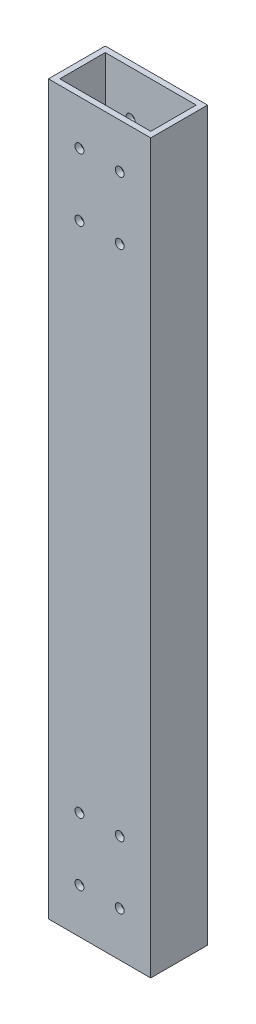
ISO-10303-21;
HEADER;
FILE_DESCRIPTION(('STEP AP214'),'2;1');
FILE_NAME('part.step','',(''),(''),'','','');
FILE_SCHEMA(('AUTOMOTIVE_DESIGN { 1 0 10303 214 1 1 1 1 }'));
ENDSEC;
DATA;
#1=APPLICATION_CONTEXT('core data for automotive mechanical design processes');
#2=APPLICATION_PROTOCOL_DEFINITION('international standard','automotive_design',2000,#1);
#3=PRODUCT_CONTEXT('',#1,'mechanical');
#4=PRODUCT('Part','Part','',(#3));
#5=PRODUCT_RELATED_PRODUCT_CATEGORY('part','',(#4));
#6=PRODUCT_DEFINITION_FORMATION('','',#4);
#7=PRODUCT_DEFINITION_CONTEXT('part definition',#1,'design');
#8=PRODUCT_DEFINITION('design','',#6,#7);
#9=PRODUCT_DEFINITION_SHAPE('','',#8);
#10=(LENGTH_UNIT() NAMED_UNIT(*) SI_UNIT(.MILLI.,.METRE.));
#11=(NAMED_UNIT(*) PLANE_ANGLE_UNIT() SI_UNIT($,.RADIAN.));
#12=(NAMED_UNIT(*) SI_UNIT($,.STERADIAN.) SOLID_ANGLE_UNIT());
#13=UNCERTAINTY_MEASURE_WITH_UNIT(LENGTH_MEASURE(1.E-05),#10,'distance_accuracy_value','');
#14=(GEOMETRIC_REPRESENTATION_CONTEXT(3) GLOBAL_UNCERTAINTY_ASSIGNED_CONTEXT((#13)) GLOBAL_UNIT_ASSIGNED_CONTEXT((#10,
#11,#12)) REPRESENTATION_CONTEXT('',''));
#15=CARTESIAN_POINT('',(0.,0.,0.));
#16=DIRECTION('',(0.,0.,1.));
#17=DIRECTION('',(1.,0.,0.));
#18=AXIS2_PLACEMENT_3D('',#15,#16,#17);
#19=CARTESIAN_POINT('',(0.,406.4,0.));
#20=DIRECTION('',(0.,-1.,0.));
#21=DIRECTION('',(0.,0.,-1.));
#22=AXIS2_PLACEMENT_3D('',#19,#20,#21);
#23=PLANE('',#22);
#24=DIRECTION('',(0.,0.,-1.));
#25=VECTOR('',#24,1.);
#26=CARTESIAN_POINT('',(28.575,406.4,15.875));
#27=LINE('',#26,#25);
#28=CARTESIAN_POINT('',(28.575,406.4,15.875));
#29=VERTEX_POINT('',#28);
#30=CARTESIAN_POINT('',(28.575,406.4,-15.875));
#31=VERTEX_POINT('',#30);
#32=EDGE_CURVE('E148',#29,#31,#27,.T.);
#33=ORIENTED_EDGE('',*,*,#32,.T.);
#34=DIRECTION('',(-1.,0.,0.));
#35=VECTOR('',#34,1.);
#36=CARTESIAN_POINT('',(-28.575,406.4,-15.875));
#37=LINE('',#36,#35);
#38=CARTESIAN_POINT('',(-28.575,406.4,-15.875));
#39=VERTEX_POINT('',#38);
#40=EDGE_CURVE('E149',#31,#39,#37,.T.);
#41=ORIENTED_EDGE('',*,*,#40,.T.);
#42=DIRECTION('',(0.,0.,1.));
#43=VECTOR('',#42,1.);
#44=CARTESIAN_POINT('',(-28.575,406.4,15.875));
#45=LINE('',#44,#43);
#46=CARTESIAN_POINT('',(-28.575,406.4,15.875));
#47=VERTEX_POINT('',#46);
#48=EDGE_CURVE('E155',#39,#47,#45,.T.);
#49=ORIENTED_EDGE('',*,*,#48,.T.);
#50=DIRECTION('',(1.,0.,0.));
#51=VECTOR('',#50,1.);
#52=CARTESIAN_POINT('',(-28.575,406.4,15.875));
#53=LINE('',#52,#51);
#54=EDGE_CURVE('E152',#47,#29,#53,.T.);
#55=ORIENTED_EDGE('',*,*,#54,.T.);
#56=EDGE_LOOP('',(#33,#41,#49,#55));
#57=FACE_BOUND('',#56,.T.);
#58=DIRECTION('',(0.,0.,-1.));
#59=VECTOR('',#58,1.);
#60=CARTESIAN_POINT('',(25.4,406.4,12.7));
#61=LINE('',#60,#59);
#62=CARTESIAN_POINT('',(25.4,406.4,12.7));
#63=VERTEX_POINT('',#62);
#64=CARTESIAN_POINT('',(25.4,406.4,-12.7));
#65=VERTEX_POINT('',#64);
#66=EDGE_CURVE('E107',#63,#65,#61,.T.);
#67=ORIENTED_EDGE('',*,*,#66,.F.);
#68=DIRECTION('',(1.,0.,0.));
#69=VECTOR('',#68,1.);
#70=CARTESIAN_POINT('',(-25.4,406.4,12.7));
#71=LINE('',#70,#69);
#72=CARTESIAN_POINT('',(-25.4,406.4,12.7));
#73=VERTEX_POINT('',#72);
#74=EDGE_CURVE('E128',#73,#63,#71,.T.);
#75=ORIENTED_EDGE('',*,*,#74,.F.);
#76=DIRECTION('',(0.,0.,1.));
#77=VECTOR('',#76,1.);
#78=CARTESIAN_POINT('',(-25.4,406.4,12.7));
#79=LINE('',#78,#77);
#80=CARTESIAN_POINT('',(-25.4,406.4,-12.7));
#81=VERTEX_POINT('',#80);
#82=EDGE_CURVE('E126',#81,#73,#79,.T.);
#83=ORIENTED_EDGE('',*,*,#82,.F.);
#84=DIRECTION('',(-1.,0.,0.));
#85=VECTOR('',#84,1.);
#86=CARTESIAN_POINT('',(-25.4,406.4,-12.7));
#87=LINE('',#86,#85);
#88=EDGE_CURVE('E117',#65,#81,#87,.T.);
#89=ORIENTED_EDGE('',*,*,#88,.F.);
#90=EDGE_LOOP('',(#67,#75,#83,#89));
#91=FACE_BOUND('',#90,.T.);
#92=ADVANCED_FACE('F41',(#57,#91),#23,.F.);
#93=CARTESIAN_POINT('',(0.,0.,0.));
#94=DIRECTION('',(0.,-1.,0.));
#95=DIRECTION('',(0.,0.,-1.));
#96=AXIS2_PLACEMENT_3D('',#93,#94,#95);
#97=PLANE('',#96);
#98=DIRECTION('',(0.,0.,-1.));
#99=VECTOR('',#98,1.);
#100=CARTESIAN_POINT('',(28.575,0.,15.875));
#101=LINE('',#100,#99);
#102=CARTESIAN_POINT('',(28.575,0.,15.875));
#103=VERTEX_POINT('',#102);
#104=CARTESIAN_POINT('',(28.575,0.,-15.875));
#105=VERTEX_POINT('',#104);
#106=EDGE_CURVE('E122',#103,#105,#101,.T.);
#107=ORIENTED_EDGE('',*,*,#106,.F.);
#108=DIRECTION('',(1.,0.,0.));
#109=VECTOR('',#108,1.);
#110=CARTESIAN_POINT('',(-28.575,0.,15.875));
#111=LINE('',#110,#109);
#112=CARTESIAN_POINT('',(-28.575,0.,15.875));
#113=VERTEX_POINT('',#112);
#114=EDGE_CURVE('E147',#113,#103,#111,.T.);
#115=ORIENTED_EDGE('',*,*,#114,.F.);
#116=DIRECTION('',(0.,0.,1.));
#117=VECTOR('',#116,1.);
#118=CARTESIAN_POINT('',(-28.575,0.,15.875));
#119=LINE('',#118,#117);
#120=CARTESIAN_POINT('',(-28.575,0.,-15.875));
#121=VERTEX_POINT('',#120);
#122=EDGE_CURVE('E161',#121,#113,#119,.T.);
#123=ORIENTED_EDGE('',*,*,#122,.F.);
#124=DIRECTION('',(-1.,0.,0.));
#125=VECTOR('',#124,1.);
#126=CARTESIAN_POINT('',(-28.575,0.,-15.875));
#127=LINE('',#126,#125);
#128=EDGE_CURVE('E157',#105,#121,#127,.T.);
#129=ORIENTED_EDGE('',*,*,#128,.F.);
#130=EDGE_LOOP('',(#107,#115,#123,#129));
#131=FACE_BOUND('',#130,.T.);
#132=DIRECTION('',(1.,0.,0.));
#133=VECTOR('',#132,1.);
#134=CARTESIAN_POINT('',(-25.4,0.,12.7));
#135=LINE('',#134,#133);
#136=CARTESIAN_POINT('',(-25.4,0.,12.7));
#137=VERTEX_POINT('',#136);
#138=CARTESIAN_POINT('',(25.4,0.,12.7));
#139=VERTEX_POINT('',#138);
#140=EDGE_CURVE('E119',#137,#139,#135,.T.);
#141=ORIENTED_EDGE('',*,*,#140,.T.);
#142=DIRECTION('',(0.,0.,-1.));
#143=VECTOR('',#142,1.);
#144=CARTESIAN_POINT('',(25.4,0.,12.7));
#145=LINE('',#144,#143);
#146=CARTESIAN_POINT('',(25.4,0.,-12.7));
#147=VERTEX_POINT('',#146);
#148=EDGE_CURVE('E66',#139,#147,#145,.T.);
#149=ORIENTED_EDGE('',*,*,#148,.T.);
#150=DIRECTION('',(-1.,0.,0.));
#151=VECTOR('',#150,1.);
#152=CARTESIAN_POINT('',(-25.4,0.,-12.7));
#153=LINE('',#152,#151);
#154=CARTESIAN_POINT('',(-25.4,0.,-12.7));
#155=VERTEX_POINT('',#154);
#156=EDGE_CURVE('E123',#147,#155,#153,.T.);
#157=ORIENTED_EDGE('',*,*,#156,.T.);
#158=DIRECTION('',(0.,0.,1.));
#159=VECTOR('',#158,1.);
#160=CARTESIAN_POINT('',(-25.4,0.,12.7));
#161=LINE('',#160,#159);
#162=EDGE_CURVE('E138',#155,#137,#161,.T.);
#163=ORIENTED_EDGE('',*,*,#162,.T.);
#164=EDGE_LOOP('',(#141,#149,#157,#163));
#165=FACE_BOUND('',#164,.T.);
#166=ADVANCED_FACE('F278',(#131,#165),#97,.T.);
#167=CARTESIAN_POINT('',(28.575,406.4,15.875));
#168=DIRECTION('',(-1.,0.,0.));
#169=DIRECTION('',(0.,0.,1.));
#170=AXIS2_PLACEMENT_3D('',#167,#168,#169);
#171=PLANE('',#170);
#172=ORIENTED_EDGE('',*,*,#106,.T.);
#173=DIRECTION('',(0.,-1.,0.));
#174=VECTOR('',#173,1.);
#175=CARTESIAN_POINT('',(28.575,406.4,-15.875));
#176=LINE('',#175,#174);
#177=EDGE_CURVE('E11',#31,#105,#176,.T.);
#178=ORIENTED_EDGE('',*,*,#177,.F.);
#179=ORIENTED_EDGE('',*,*,#32,.F.);
#180=DIRECTION('',(0.,-1.,0.));
#181=VECTOR('',#180,1.);
#182=CARTESIAN_POINT('',(28.575,406.4,15.875));
#183=LINE('',#182,#181);
#184=EDGE_CURVE('E156',#29,#103,#183,.T.);
#185=ORIENTED_EDGE('',*,*,#184,.T.);
#186=EDGE_LOOP('',(#172,#178,#179,#185));
#187=FACE_BOUND('',#186,.T.);
#188=ADVANCED_FACE('F43',(#187),#171,.F.);
#189=CARTESIAN_POINT('',(-28.575,406.4,-15.875));
#190=DIRECTION('',(0.,0.,1.));
#191=DIRECTION('',(1.,0.,0.));
#192=AXIS2_PLACEMENT_3D('',#189,#190,#191);
#193=PLANE('',#192);
#194=CARTESIAN_POINT('',(11.25,346.4,-15.875));
#195=DIRECTION('',(0.,0.,-1.));
#196=DIRECTION('',(1.,0.,0.));
#197=AXIS2_PLACEMENT_3D('',#194,#195,#196);
#198=CIRCLE('',#197,2.5);
#199=CARTESIAN_POINT('',(13.75,346.4,-15.875));
#200=VERTEX_POINT('',#199);
#201=EDGE_CURVE('E513',#200,#200,#198,.T.);
#202=ORIENTED_EDGE('',*,*,#201,.F.);
#203=EDGE_LOOP('',(#202));
#204=FACE_BOUND('',#203,.T.);
#205=CARTESIAN_POINT('',(11.25,381.4,-15.875));
#206=DIRECTION('',(0.,0.,-1.));
#207=DIRECTION('',(1.,0.,0.));
#208=AXIS2_PLACEMENT_3D('',#205,#206,#207);
#209=CIRCLE('',#208,2.5);
#210=CARTESIAN_POINT('',(13.75,381.4,-15.875));
#211=VERTEX_POINT('',#210);
#212=EDGE_CURVE('E518',#211,#211,#209,.T.);
#213=ORIENTED_EDGE('',*,*,#212,.F.);
#214=EDGE_LOOP('',(#213));
#215=FACE_BOUND('',#214,.T.);
#216=CARTESIAN_POINT('',(-11.25,381.4,-15.875));
#217=DIRECTION('',(0.,0.,-1.));
#218=DIRECTION('',(1.,0.,0.));
#219=AXIS2_PLACEMENT_3D('',#216,#217,#218);
#220=CIRCLE('',#219,2.5);
#221=CARTESIAN_POINT('',(-8.75,381.4,-15.875));
#222=VERTEX_POINT('',#221);
#223=EDGE_CURVE('E530',#222,#222,#220,.T.);
#224=ORIENTED_EDGE('',*,*,#223,.F.);
#225=EDGE_LOOP('',(#224));
#226=FACE_BOUND('',#225,.T.);
#227=CARTESIAN_POINT('',(-11.25,346.4,-15.875));
#228=DIRECTION('',(0.,0.,-1.));
#229=DIRECTION('',(1.,0.,0.));
#230=AXIS2_PLACEMENT_3D('',#227,#228,#229);
#231=CIRCLE('',#230,2.5);
#232=CARTESIAN_POINT('',(-8.75,346.4,-15.875));
#233=VERTEX_POINT('',#232);
#234=EDGE_CURVE('E191',#233,#233,#231,.T.);
#235=ORIENTED_EDGE('',*,*,#234,.F.);
#236=EDGE_LOOP('',(#235));
#237=FACE_BOUND('',#236,.T.);
#238=CARTESIAN_POINT('',(11.25,60.,-15.875));
#239=DIRECTION('',(0.,0.,1.));
#240=DIRECTION('',(1.,0.,0.));
#241=AXIS2_PLACEMENT_3D('',#238,#239,#240);
#242=CIRCLE('',#241,2.5);
#243=CARTESIAN_POINT('',(13.75,60.,-15.875));
#244=VERTEX_POINT('',#243);
#245=EDGE_CURVE('E215',#244,#244,#242,.T.);
#246=ORIENTED_EDGE('',*,*,#245,.T.);
#247=EDGE_LOOP('',(#246));
#248=FACE_BOUND('',#247,.T.);
#249=CARTESIAN_POINT('',(11.25,25.,-15.875));
#250=DIRECTION('',(0.,0.,1.));
#251=DIRECTION('',(1.,0.,0.));
#252=AXIS2_PLACEMENT_3D('',#249,#250,#251);
#253=CIRCLE('',#252,2.5);
#254=CARTESIAN_POINT('',(13.75,25.,-15.875));
#255=VERTEX_POINT('',#254);
#256=EDGE_CURVE('E224',#255,#255,#253,.T.);
#257=ORIENTED_EDGE('',*,*,#256,.T.);
#258=EDGE_LOOP('',(#257));
#259=FACE_BOUND('',#258,.T.);
#260=CARTESIAN_POINT('',(-11.25,25.,-15.875));
#261=DIRECTION('',(0.,0.,1.));
#262=DIRECTION('',(1.,0.,0.));
#263=AXIS2_PLACEMENT_3D('',#260,#261,#262);
#264=CIRCLE('',#263,2.5);
#265=CARTESIAN_POINT('',(-8.75,25.,-15.875));
#266=VERTEX_POINT('',#265);
#267=EDGE_CURVE('E220',#266,#266,#264,.T.);
#268=ORIENTED_EDGE('',*,*,#267,.T.);
#269=EDGE_LOOP('',(#268));
#270=FACE_BOUND('',#269,.T.);
#271=CARTESIAN_POINT('',(-11.25,60.,-15.875));
#272=DIRECTION('',(0.,0.,1.));
#273=DIRECTION('',(1.,0.,0.));
#274=AXIS2_PLACEMENT_3D('',#271,#272,#273);
#275=CIRCLE('',#274,2.5);
#276=CARTESIAN_POINT('',(-8.75,60.,-15.875));
#277=VERTEX_POINT('',#276);
#278=EDGE_CURVE('E173',#277,#277,#275,.T.);
#279=ORIENTED_EDGE('',*,*,#278,.T.);
#280=EDGE_LOOP('',(#279));
#281=FACE_BOUND('',#280,.T.);
#282=ORIENTED_EDGE('',*,*,#128,.T.);
#283=DIRECTION('',(0.,-1.,0.));
#284=VECTOR('',#283,1.);
#285=CARTESIAN_POINT('',(-28.575,406.4,-15.875));
#286=LINE('',#285,#284);
#287=EDGE_CURVE('E49',#39,#121,#286,.T.);
#288=ORIENTED_EDGE('',*,*,#287,.F.);
#289=ORIENTED_EDGE('',*,*,#40,.F.);
#290=ORIENTED_EDGE('',*,*,#177,.T.);
#291=EDGE_LOOP('',(#282,#288,#289,#290));
#292=FACE_BOUND('',#291,.T.);
#293=ADVANCED_FACE('F266',(#204,#215,#226,#237,#248,#259,#270,#281,#292),#193,.F.);
#294=CARTESIAN_POINT('',(-28.575,406.4,15.875));
#295=DIRECTION('',(1.,0.,0.));
#296=DIRECTION('',(0.,0.,-1.));
#297=AXIS2_PLACEMENT_3D('',#294,#295,#296);
#298=PLANE('',#297);
#299=ORIENTED_EDGE('',*,*,#122,.T.);
#300=DIRECTION('',(0.,-1.,0.));
#301=VECTOR('',#300,1.);
#302=CARTESIAN_POINT('',(-28.575,406.4,15.875));
#303=LINE('',#302,#301);
#304=EDGE_CURVE('E167',#47,#113,#303,.T.);
#305=ORIENTED_EDGE('',*,*,#304,.F.);
#306=ORIENTED_EDGE('',*,*,#48,.F.);
#307=ORIENTED_EDGE('',*,*,#287,.T.);
#308=EDGE_LOOP('',(#299,#305,#306,#307));
#309=FACE_BOUND('',#308,.T.);
#310=ADVANCED_FACE('F267',(#309),#298,.F.);
#311=CARTESIAN_POINT('',(-28.575,406.4,15.875));
#312=DIRECTION('',(0.,0.,-1.));
#313=DIRECTION('',(-1.,0.,0.));
#314=AXIS2_PLACEMENT_3D('',#311,#312,#313);
#315=PLANE('',#314);
#316=CARTESIAN_POINT('',(11.25,346.4,15.875));
#317=DIRECTION('',(0.,0.,-1.));
#318=DIRECTION('',(1.,0.,0.));
#319=AXIS2_PLACEMENT_3D('',#316,#317,#318);
#320=CIRCLE('',#319,2.5);
#321=CARTESIAN_POINT('',(13.75,346.4,15.875));
#322=VERTEX_POINT('',#321);
#323=EDGE_CURVE('E519',#322,#322,#320,.T.);
#324=ORIENTED_EDGE('',*,*,#323,.T.);
#325=EDGE_LOOP('',(#324));
#326=FACE_BOUND('',#325,.T.);
#327=CARTESIAN_POINT('',(11.25,381.4,15.875));
#328=DIRECTION('',(0.,0.,-1.));
#329=DIRECTION('',(1.,0.,0.));
#330=AXIS2_PLACEMENT_3D('',#327,#328,#329);
#331=CIRCLE('',#330,2.5);
#332=CARTESIAN_POINT('',(13.75,381.4,15.875));
#333=VERTEX_POINT('',#332);
#334=EDGE_CURVE('E517',#333,#333,#331,.T.);
#335=ORIENTED_EDGE('',*,*,#334,.T.);
#336=EDGE_LOOP('',(#335));
#337=FACE_BOUND('',#336,.T.);
#338=CARTESIAN_POINT('',(-11.25,381.4,15.875));
#339=DIRECTION('',(0.,0.,-1.));
#340=DIRECTION('',(1.,0.,0.));
#341=AXIS2_PLACEMENT_3D('',#338,#339,#340);
#342=CIRCLE('',#341,2.5);
#343=CARTESIAN_POINT('',(-8.75,381.4,15.875));
#344=VERTEX_POINT('',#343);
#345=EDGE_CURVE('E531',#344,#344,#342,.T.);
#346=ORIENTED_EDGE('',*,*,#345,.T.);
#347=EDGE_LOOP('',(#346));
#348=FACE_BOUND('',#347,.T.);
#349=CARTESIAN_POINT('',(-11.25,346.4,15.875));
#350=DIRECTION('',(0.,0.,-1.));
#351=DIRECTION('',(1.,0.,0.));
#352=AXIS2_PLACEMENT_3D('',#349,#350,#351);
#353=CIRCLE('',#352,2.5);
#354=CARTESIAN_POINT('',(-8.75,346.4,15.875));
#355=VERTEX_POINT('',#354);
#356=EDGE_CURVE('E527',#355,#355,#353,.T.);
#357=ORIENTED_EDGE('',*,*,#356,.T.);
#358=EDGE_LOOP('',(#357));
#359=FACE_BOUND('',#358,.T.);
#360=CARTESIAN_POINT('',(11.25,60.,15.875));
#361=DIRECTION('',(0.,0.,1.));
#362=DIRECTION('',(1.,0.,0.));
#363=AXIS2_PLACEMENT_3D('',#360,#361,#362);
#364=CIRCLE('',#363,2.5);
#365=CARTESIAN_POINT('',(13.75,60.,15.875));
#366=VERTEX_POINT('',#365);
#367=EDGE_CURVE('E227',#366,#366,#364,.T.);
#368=ORIENTED_EDGE('',*,*,#367,.F.);
#369=EDGE_LOOP('',(#368));
#370=FACE_BOUND('',#369,.T.);
#371=CARTESIAN_POINT('',(11.25,25.,15.875));
#372=DIRECTION('',(0.,0.,1.));
#373=DIRECTION('',(1.,0.,0.));
#374=AXIS2_PLACEMENT_3D('',#371,#372,#373);
#375=CIRCLE('',#374,2.5);
#376=CARTESIAN_POINT('',(13.75,25.,15.875));
#377=VERTEX_POINT('',#376);
#378=EDGE_CURVE('E219',#377,#377,#375,.T.);
#379=ORIENTED_EDGE('',*,*,#378,.F.);
#380=EDGE_LOOP('',(#379));
#381=FACE_BOUND('',#380,.T.);
#382=CARTESIAN_POINT('',(-11.25,25.,15.875));
#383=DIRECTION('',(0.,0.,1.));
#384=DIRECTION('',(1.,0.,0.));
#385=AXIS2_PLACEMENT_3D('',#382,#383,#384);
#386=CIRCLE('',#385,2.5);
#387=CARTESIAN_POINT('',(-8.75,25.,15.875));
#388=VERTEX_POINT('',#387);
#389=EDGE_CURVE('E213',#388,#388,#386,.T.);
#390=ORIENTED_EDGE('',*,*,#389,.F.);
#391=EDGE_LOOP('',(#390));
#392=FACE_BOUND('',#391,.T.);
#393=CARTESIAN_POINT('',(-11.25,60.,15.875));
#394=DIRECTION('',(0.,0.,1.));
#395=DIRECTION('',(1.,0.,0.));
#396=AXIS2_PLACEMENT_3D('',#393,#394,#395);
#397=CIRCLE('',#396,2.5);
#398=CARTESIAN_POINT('',(-8.75,60.,15.875));
#399=VERTEX_POINT('',#398);
#400=EDGE_CURVE('E216',#399,#399,#397,.T.);
#401=ORIENTED_EDGE('',*,*,#400,.F.);
#402=EDGE_LOOP('',(#401));
#403=FACE_BOUND('',#402,.T.);
#404=ORIENTED_EDGE('',*,*,#114,.T.);
#405=ORIENTED_EDGE('',*,*,#184,.F.);
#406=ORIENTED_EDGE('',*,*,#54,.F.);
#407=ORIENTED_EDGE('',*,*,#304,.T.);
#408=EDGE_LOOP('',(#404,#405,#406,#407));
#409=FACE_BOUND('',#408,.T.);
#410=ADVANCED_FACE('F281',(#326,#337,#348,#359,#370,#381,#392,#403,#409),#315,.F.);
#411=CARTESIAN_POINT('',(25.4,406.4,12.7));
#412=DIRECTION('',(-1.,0.,0.));
#413=DIRECTION('',(0.,0.,1.));
#414=AXIS2_PLACEMENT_3D('',#411,#412,#413);
#415=PLANE('',#414);
#416=ORIENTED_EDGE('',*,*,#148,.F.);
#417=DIRECTION('',(0.,-1.,0.));
#418=VECTOR('',#417,1.);
#419=CARTESIAN_POINT('',(25.4,406.4,12.7));
#420=LINE('',#419,#418);
#421=EDGE_CURVE('E115',#63,#139,#420,.T.);
#422=ORIENTED_EDGE('',*,*,#421,.F.);
#423=ORIENTED_EDGE('',*,*,#66,.T.);
#424=DIRECTION('',(0.,-1.,0.));
#425=VECTOR('',#424,1.);
#426=CARTESIAN_POINT('',(25.4,406.4,-12.7));
#427=LINE('',#426,#425);
#428=EDGE_CURVE('E112',#65,#147,#427,.T.);
#429=ORIENTED_EDGE('',*,*,#428,.T.);
#430=EDGE_LOOP('',(#416,#422,#423,#429));
#431=FACE_BOUND('',#430,.T.);
#432=ADVANCED_FACE('F109',(#431),#415,.T.);
#433=CARTESIAN_POINT('',(-25.4,406.4,-12.7));
#434=DIRECTION('',(0.,0.,1.));
#435=DIRECTION('',(1.,0.,0.));
#436=AXIS2_PLACEMENT_3D('',#433,#434,#435);
#437=PLANE('',#436);
#438=CARTESIAN_POINT('',(11.25,346.4,-12.7));
#439=DIRECTION('',(0.,0.,1.));
#440=DIRECTION('',(1.,0.,0.));
#441=AXIS2_PLACEMENT_3D('',#438,#439,#440);
#442=CIRCLE('',#441,2.5);
#443=CARTESIAN_POINT('',(13.75,346.4,-12.7));
#444=VERTEX_POINT('',#443);
#445=EDGE_CURVE('E207',#444,#444,#442,.F.);
#446=ORIENTED_EDGE('',*,*,#445,.T.);
#447=EDGE_LOOP('',(#446));
#448=FACE_BOUND('',#447,.T.);
#449=CARTESIAN_POINT('',(11.25,381.4,-12.7));
#450=DIRECTION('',(0.,0.,1.));
#451=DIRECTION('',(1.,0.,0.));
#452=AXIS2_PLACEMENT_3D('',#449,#450,#451);
#453=CIRCLE('',#452,2.5);
#454=CARTESIAN_POINT('',(13.75,381.4,-12.7));
#455=VERTEX_POINT('',#454);
#456=EDGE_CURVE('E197',#455,#455,#453,.F.);
#457=ORIENTED_EDGE('',*,*,#456,.T.);
#458=EDGE_LOOP('',(#457));
#459=FACE_BOUND('',#458,.T.);
#460=CARTESIAN_POINT('',(-11.25,381.4,-12.7));
#461=DIRECTION('',(0.,0.,1.));
#462=DIRECTION('',(1.,0.,0.));
#463=AXIS2_PLACEMENT_3D('',#460,#461,#462);
#464=CIRCLE('',#463,2.5);
#465=CARTESIAN_POINT('',(-8.75,381.4,-12.7));
#466=VERTEX_POINT('',#465);
#467=EDGE_CURVE('E192',#466,#466,#464,.F.);
#468=ORIENTED_EDGE('',*,*,#467,.T.);
#469=EDGE_LOOP('',(#468));
#470=FACE_BOUND('',#469,.T.);
#471=CARTESIAN_POINT('',(-11.25,346.4,-12.7));
#472=DIRECTION('',(0.,0.,1.));
#473=DIRECTION('',(1.,0.,0.));
#474=AXIS2_PLACEMENT_3D('',#471,#472,#473);
#475=CIRCLE('',#474,2.5);
#476=CARTESIAN_POINT('',(-8.75,346.4,-12.7));
#477=VERTEX_POINT('',#476);
#478=EDGE_CURVE('E188',#477,#477,#475,.F.);
#479=ORIENTED_EDGE('',*,*,#478,.T.);
#480=EDGE_LOOP('',(#479));
#481=FACE_BOUND('',#480,.T.);
#482=CARTESIAN_POINT('',(11.25,60.,-12.7));
#483=DIRECTION('',(0.,0.,1.));
#484=DIRECTION('',(1.,0.,0.));
#485=AXIS2_PLACEMENT_3D('',#482,#483,#484);
#486=CIRCLE('',#485,2.5);
#487=CARTESIAN_POINT('',(13.75,60.,-12.7));
#488=VERTEX_POINT('',#487);
#489=EDGE_CURVE('E136',#488,#488,#486,.T.);
#490=ORIENTED_EDGE('',*,*,#489,.F.);
#491=EDGE_LOOP('',(#490));
#492=FACE_BOUND('',#491,.T.);
#493=CARTESIAN_POINT('',(11.25,25.,-12.7));
#494=DIRECTION('',(0.,0.,1.));
#495=DIRECTION('',(1.,0.,0.));
#496=AXIS2_PLACEMENT_3D('',#493,#494,#495);
#497=CIRCLE('',#496,2.5);
#498=CARTESIAN_POINT('',(13.75,25.,-12.7));
#499=VERTEX_POINT('',#498);
#500=EDGE_CURVE('E181',#499,#499,#497,.T.);
#501=ORIENTED_EDGE('',*,*,#500,.F.);
#502=EDGE_LOOP('',(#501));
#503=FACE_BOUND('',#502,.T.);
#504=CARTESIAN_POINT('',(-11.25,25.,-12.7));
#505=DIRECTION('',(0.,0.,1.));
#506=DIRECTION('',(1.,0.,0.));
#507=AXIS2_PLACEMENT_3D('',#504,#505,#506);
#508=CIRCLE('',#507,2.5);
#509=CARTESIAN_POINT('',(-8.75,25.,-12.7));
#510=VERTEX_POINT('',#509);
#511=EDGE_CURVE('E177',#510,#510,#508,.T.);
#512=ORIENTED_EDGE('',*,*,#511,.F.);
#513=EDGE_LOOP('',(#512));
#514=FACE_BOUND('',#513,.T.);
#515=CARTESIAN_POINT('',(-11.25,60.,-12.7));
#516=DIRECTION('',(0.,0.,1.));
#517=DIRECTION('',(1.,0.,0.));
#518=AXIS2_PLACEMENT_3D('',#515,#516,#517);
#519=CIRCLE('',#518,2.5);
#520=CARTESIAN_POINT('',(-8.75,60.,-12.7));
#521=VERTEX_POINT('',#520);
#522=EDGE_CURVE('E171',#521,#521,#519,.T.);
#523=ORIENTED_EDGE('',*,*,#522,.F.);
#524=EDGE_LOOP('',(#523));
#525=FACE_BOUND('',#524,.T.);
#526=ORIENTED_EDGE('',*,*,#156,.F.);
#527=ORIENTED_EDGE('',*,*,#428,.F.);
#528=ORIENTED_EDGE('',*,*,#88,.T.);
#529=DIRECTION('',(0.,-1.,0.));
#530=VECTOR('',#529,1.);
#531=CARTESIAN_POINT('',(-25.4,406.4,-12.7));
#532=LINE('',#531,#530);
#533=EDGE_CURVE('E124',#81,#155,#532,.T.);
#534=ORIENTED_EDGE('',*,*,#533,.T.);
#535=EDGE_LOOP('',(#526,#527,#528,#534));
#536=FACE_BOUND('',#535,.T.);
#537=ADVANCED_FACE('F118',(#448,#459,#470,#481,#492,#503,#514,#525,#536),#437,.T.);
#538=CARTESIAN_POINT('',(-25.4,406.4,12.7));
#539=DIRECTION('',(1.,0.,0.));
#540=DIRECTION('',(0.,0.,-1.));
#541=AXIS2_PLACEMENT_3D('',#538,#539,#540);
#542=PLANE('',#541);
#543=ORIENTED_EDGE('',*,*,#162,.F.);
#544=ORIENTED_EDGE('',*,*,#533,.F.);
#545=ORIENTED_EDGE('',*,*,#82,.T.);
#546=DIRECTION('',(0.,-1.,0.));
#547=VECTOR('',#546,1.);
#548=CARTESIAN_POINT('',(-25.4,406.4,12.7));
#549=LINE('',#548,#547);
#550=EDGE_CURVE('E59',#73,#137,#549,.T.);
#551=ORIENTED_EDGE('',*,*,#550,.T.);
#552=EDGE_LOOP('',(#543,#544,#545,#551));
#553=FACE_BOUND('',#552,.T.);
#554=ADVANCED_FACE('F248',(#553),#542,.T.);
#555=CARTESIAN_POINT('',(-25.4,406.4,12.7));
#556=DIRECTION('',(0.,0.,-1.));
#557=DIRECTION('',(-1.,0.,0.));
#558=AXIS2_PLACEMENT_3D('',#555,#556,#557);
#559=PLANE('',#558);
#560=CARTESIAN_POINT('',(11.25,346.4,12.7));
#561=DIRECTION('',(0.,0.,-1.));
#562=DIRECTION('',(-1.,0.,0.));
#563=AXIS2_PLACEMENT_3D('',#560,#561,#562);
#564=CIRCLE('',#563,2.5);
#565=CARTESIAN_POINT('',(8.75,346.4,12.7));
#566=VERTEX_POINT('',#565);
#567=EDGE_CURVE('E44',#566,#566,#564,.F.);
#568=ORIENTED_EDGE('',*,*,#567,.T.);
#569=EDGE_LOOP('',(#568));
#570=FACE_BOUND('',#569,.T.);
#571=CARTESIAN_POINT('',(11.25,381.4,12.7));
#572=DIRECTION('',(0.,0.,-1.));
#573=DIRECTION('',(-1.,0.,0.));
#574=AXIS2_PLACEMENT_3D('',#571,#572,#573);
#575=CIRCLE('',#574,2.5);
#576=CARTESIAN_POINT('',(8.75,381.4,12.7));
#577=VERTEX_POINT('',#576);
#578=EDGE_CURVE('E194',#577,#577,#575,.F.);
#579=ORIENTED_EDGE('',*,*,#578,.T.);
#580=EDGE_LOOP('',(#579));
#581=FACE_BOUND('',#580,.T.);
#582=CARTESIAN_POINT('',(-11.25,381.4,12.7));
#583=DIRECTION('',(0.,0.,-1.));
#584=DIRECTION('',(-1.,0.,0.));
#585=AXIS2_PLACEMENT_3D('',#582,#583,#584);
#586=CIRCLE('',#585,2.5);
#587=CARTESIAN_POINT('',(-13.75,381.4,12.7));
#588=VERTEX_POINT('',#587);
#589=EDGE_CURVE('E195',#588,#588,#586,.F.);
#590=ORIENTED_EDGE('',*,*,#589,.T.);
#591=EDGE_LOOP('',(#590));
#592=FACE_BOUND('',#591,.T.);
#593=CARTESIAN_POINT('',(-11.25,346.4,12.7));
#594=DIRECTION('',(0.,0.,-1.));
#595=DIRECTION('',(-1.,0.,0.));
#596=AXIS2_PLACEMENT_3D('',#593,#594,#595);
#597=CIRCLE('',#596,2.5);
#598=CARTESIAN_POINT('',(-13.75,346.4,12.7));
#599=VERTEX_POINT('',#598);
#600=EDGE_CURVE('E189',#599,#599,#597,.F.);
#601=ORIENTED_EDGE('',*,*,#600,.T.);
#602=EDGE_LOOP('',(#601));
#603=FACE_BOUND('',#602,.T.);
#604=CARTESIAN_POINT('',(11.25,60.,12.7));
#605=DIRECTION('',(0.,0.,-1.));
#606=DIRECTION('',(-1.,0.,0.));
#607=AXIS2_PLACEMENT_3D('',#604,#605,#606);
#608=CIRCLE('',#607,2.5);
#609=CARTESIAN_POINT('',(8.75,60.,12.7));
#610=VERTEX_POINT('',#609);
#611=EDGE_CURVE('E184',#610,#610,#608,.T.);
#612=ORIENTED_EDGE('',*,*,#611,.F.);
#613=EDGE_LOOP('',(#612));
#614=FACE_BOUND('',#613,.T.);
#615=CARTESIAN_POINT('',(11.25,25.,12.7));
#616=DIRECTION('',(0.,0.,-1.));
#617=DIRECTION('',(-1.,0.,0.));
#618=AXIS2_PLACEMENT_3D('',#615,#616,#617);
#619=CIRCLE('',#618,2.5);
#620=CARTESIAN_POINT('',(8.75,25.,12.7));
#621=VERTEX_POINT('',#620);
#622=EDGE_CURVE('E179',#621,#621,#619,.T.);
#623=ORIENTED_EDGE('',*,*,#622,.F.);
#624=EDGE_LOOP('',(#623));
#625=FACE_BOUND('',#624,.T.);
#626=CARTESIAN_POINT('',(-11.25,25.,12.7));
#627=DIRECTION('',(0.,0.,-1.));
#628=DIRECTION('',(-1.,0.,0.));
#629=AXIS2_PLACEMENT_3D('',#626,#627,#628);
#630=CIRCLE('',#629,2.5);
#631=CARTESIAN_POINT('',(-13.75,25.,12.7));
#632=VERTEX_POINT('',#631);
#633=EDGE_CURVE('E176',#632,#632,#630,.T.);
#634=ORIENTED_EDGE('',*,*,#633,.F.);
#635=EDGE_LOOP('',(#634));
#636=FACE_BOUND('',#635,.T.);
#637=CARTESIAN_POINT('',(-11.25,60.,12.7));
#638=DIRECTION('',(0.,0.,-1.));
#639=DIRECTION('',(-1.,0.,0.));
#640=AXIS2_PLACEMENT_3D('',#637,#638,#639);
#641=CIRCLE('',#640,2.5);
#642=CARTESIAN_POINT('',(-13.75,60.,12.7));
#643=VERTEX_POINT('',#642);
#644=EDGE_CURVE('E172',#643,#643,#641,.T.);
#645=ORIENTED_EDGE('',*,*,#644,.F.);
#646=EDGE_LOOP('',(#645));
#647=FACE_BOUND('',#646,.T.);
#648=ORIENTED_EDGE('',*,*,#140,.F.);
#649=ORIENTED_EDGE('',*,*,#550,.F.);
#650=ORIENTED_EDGE('',*,*,#74,.T.);
#651=ORIENTED_EDGE('',*,*,#421,.T.);
#652=EDGE_LOOP('',(#648,#649,#650,#651));
#653=FACE_BOUND('',#652,.T.);
#654=ADVANCED_FACE('F325',(#570,#581,#592,#603,#614,#625,#636,#647,#653),#559,.T.);
#655=CARTESIAN_POINT('',(-11.25,60.,-15.875));
#656=DIRECTION('',(0.,0.,1.));
#657=DIRECTION('',(1.,0.,0.));
#658=AXIS2_PLACEMENT_3D('',#655,#656,#657);
#659=CYLINDRICAL_SURFACE('',#658,2.5);
#660=ORIENTED_EDGE('',*,*,#644,.T.);
#661=EDGE_LOOP('',(#660));
#662=FACE_BOUND('',#661,.T.);
#663=ORIENTED_EDGE('',*,*,#400,.T.);
#664=EDGE_LOOP('',(#663));
#665=FACE_BOUND('',#664,.T.);
#666=ADVANCED_FACE('F263',(#662,#665),#659,.F.);
#667=CARTESIAN_POINT('',(-11.25,25.,-15.875));
#668=DIRECTION('',(0.,0.,1.));
#669=DIRECTION('',(1.,0.,0.));
#670=AXIS2_PLACEMENT_3D('',#667,#668,#669);
#671=CYLINDRICAL_SURFACE('',#670,2.5);
#672=ORIENTED_EDGE('',*,*,#633,.T.);
#673=EDGE_LOOP('',(#672));
#674=FACE_BOUND('',#673,.T.);
#675=ORIENTED_EDGE('',*,*,#389,.T.);
#676=EDGE_LOOP('',(#675));
#677=FACE_BOUND('',#676,.T.);
#678=ADVANCED_FACE('F335',(#674,#677),#671,.F.);
#679=CARTESIAN_POINT('',(11.25,25.,-15.875));
#680=DIRECTION('',(0.,0.,1.));
#681=DIRECTION('',(1.,0.,0.));
#682=AXIS2_PLACEMENT_3D('',#679,#680,#681);
#683=CYLINDRICAL_SURFACE('',#682,2.5);
#684=ORIENTED_EDGE('',*,*,#622,.T.);
#685=EDGE_LOOP('',(#684));
#686=FACE_BOUND('',#685,.T.);
#687=ORIENTED_EDGE('',*,*,#378,.T.);
#688=EDGE_LOOP('',(#687));
#689=FACE_BOUND('',#688,.T.);
#690=ADVANCED_FACE('F338',(#686,#689),#683,.F.);
#691=CARTESIAN_POINT('',(11.25,60.,-15.875));
#692=DIRECTION('',(0.,0.,1.));
#693=DIRECTION('',(1.,0.,0.));
#694=AXIS2_PLACEMENT_3D('',#691,#692,#693);
#695=CYLINDRICAL_SURFACE('',#694,2.5);
#696=ORIENTED_EDGE('',*,*,#611,.T.);
#697=EDGE_LOOP('',(#696));
#698=FACE_BOUND('',#697,.T.);
#699=ORIENTED_EDGE('',*,*,#367,.T.);
#700=EDGE_LOOP('',(#699));
#701=FACE_BOUND('',#700,.T.);
#702=ADVANCED_FACE('F261',(#698,#701),#695,.F.);
#703=ORIENTED_EDGE('',*,*,#522,.T.);
#704=EDGE_LOOP('',(#703));
#705=FACE_BOUND('',#704,.T.);
#706=ORIENTED_EDGE('',*,*,#278,.F.);
#707=EDGE_LOOP('',(#706));
#708=FACE_BOUND('',#707,.T.);
#709=ADVANCED_FACE('F260',(#705,#708),#659,.F.);
#710=ORIENTED_EDGE('',*,*,#511,.T.);
#711=EDGE_LOOP('',(#710));
#712=FACE_BOUND('',#711,.T.);
#713=ORIENTED_EDGE('',*,*,#267,.F.);
#714=EDGE_LOOP('',(#713));
#715=FACE_BOUND('',#714,.T.);
#716=ADVANCED_FACE('F257',(#712,#715),#671,.F.);
#717=ORIENTED_EDGE('',*,*,#500,.T.);
#718=EDGE_LOOP('',(#717));
#719=FACE_BOUND('',#718,.T.);
#720=ORIENTED_EDGE('',*,*,#256,.F.);
#721=EDGE_LOOP('',(#720));
#722=FACE_BOUND('',#721,.T.);
#723=ADVANCED_FACE('F352',(#719,#722),#683,.F.);
#724=ORIENTED_EDGE('',*,*,#489,.T.);
#725=EDGE_LOOP('',(#724));
#726=FACE_BOUND('',#725,.T.);
#727=ORIENTED_EDGE('',*,*,#245,.F.);
#728=EDGE_LOOP('',(#727));
#729=FACE_BOUND('',#728,.T.);
#730=ADVANCED_FACE('F245',(#726,#729),#695,.F.);
#731=CARTESIAN_POINT('',(-11.25,346.4,-15.875));
#732=DIRECTION('',(0.,0.,1.));
#733=DIRECTION('',(1.,0.,0.));
#734=AXIS2_PLACEMENT_3D('',#731,#732,#733);
#735=CYLINDRICAL_SURFACE('',#734,2.5);
#736=ORIENTED_EDGE('',*,*,#600,.F.);
#737=EDGE_LOOP('',(#736));
#738=FACE_BOUND('',#737,.T.);
#739=ORIENTED_EDGE('',*,*,#356,.F.);
#740=EDGE_LOOP('',(#739));
#741=FACE_BOUND('',#740,.T.);
#742=ADVANCED_FACE('F383',(#738,#741),#735,.F.);
#743=CARTESIAN_POINT('',(-11.25,381.4,-15.875));
#744=DIRECTION('',(0.,0.,1.));
#745=DIRECTION('',(1.,0.,0.));
#746=AXIS2_PLACEMENT_3D('',#743,#744,#745);
#747=CYLINDRICAL_SURFACE('',#746,2.5);
#748=ORIENTED_EDGE('',*,*,#589,.F.);
#749=EDGE_LOOP('',(#748));
#750=FACE_BOUND('',#749,.T.);
#751=ORIENTED_EDGE('',*,*,#345,.F.);
#752=EDGE_LOOP('',(#751));
#753=FACE_BOUND('',#752,.T.);
#754=ADVANCED_FACE('F411',(#750,#753),#747,.F.);
#755=CARTESIAN_POINT('',(11.25,381.4,-15.875));
#756=DIRECTION('',(0.,0.,1.));
#757=DIRECTION('',(1.,0.,0.));
#758=AXIS2_PLACEMENT_3D('',#755,#756,#757);
#759=CYLINDRICAL_SURFACE('',#758,2.5);
#760=ORIENTED_EDGE('',*,*,#578,.F.);
#761=EDGE_LOOP('',(#760));
#762=FACE_BOUND('',#761,.T.);
#763=ORIENTED_EDGE('',*,*,#334,.F.);
#764=EDGE_LOOP('',(#763));
#765=FACE_BOUND('',#764,.T.);
#766=ADVANCED_FACE('F423',(#762,#765),#759,.F.);
#767=CARTESIAN_POINT('',(11.25,346.4,-15.875));
#768=DIRECTION('',(0.,0.,1.));
#769=DIRECTION('',(1.,0.,0.));
#770=AXIS2_PLACEMENT_3D('',#767,#768,#769);
#771=CYLINDRICAL_SURFACE('',#770,2.5);
#772=ORIENTED_EDGE('',*,*,#567,.F.);
#773=EDGE_LOOP('',(#772));
#774=FACE_BOUND('',#773,.T.);
#775=ORIENTED_EDGE('',*,*,#323,.F.);
#776=EDGE_LOOP('',(#775));
#777=FACE_BOUND('',#776,.T.);
#778=ADVANCED_FACE('F431',(#774,#777),#771,.F.);
#779=ORIENTED_EDGE('',*,*,#478,.F.);
#780=EDGE_LOOP('',(#779));
#781=FACE_BOUND('',#780,.T.);
#782=ORIENTED_EDGE('',*,*,#234,.T.);
#783=EDGE_LOOP('',(#782));
#784=FACE_BOUND('',#783,.T.);
#785=ADVANCED_FACE('F412',(#781,#784),#735,.F.);
#786=ORIENTED_EDGE('',*,*,#467,.F.);
#787=EDGE_LOOP('',(#786));
#788=FACE_BOUND('',#787,.T.);
#789=ORIENTED_EDGE('',*,*,#223,.T.);
#790=EDGE_LOOP('',(#789));
#791=FACE_BOUND('',#790,.T.);
#792=ADVANCED_FACE('F424',(#788,#791),#747,.F.);
#793=ORIENTED_EDGE('',*,*,#456,.F.);
#794=EDGE_LOOP('',(#793));
#795=FACE_BOUND('',#794,.T.);
#796=ORIENTED_EDGE('',*,*,#212,.T.);
#797=EDGE_LOOP('',(#796));
#798=FACE_BOUND('',#797,.T.);
#799=ADVANCED_FACE('F432',(#795,#798),#759,.F.);
#800=ORIENTED_EDGE('',*,*,#445,.F.);
#801=EDGE_LOOP('',(#800));
#802=FACE_BOUND('',#801,.T.);
#803=ORIENTED_EDGE('',*,*,#201,.T.);
#804=EDGE_LOOP('',(#803));
#805=FACE_BOUND('',#804,.T.);
#806=ADVANCED_FACE('F444',(#802,#805),#771,.F.);
#807=CLOSED_SHELL('',(#92,#166,#188,#293,#310,#410,#432,#537,#554,#654,#666,#678,#690,#702,#709,
#716,#723,#730,#742,#754,#766,#778,#785,#792,#799,#806));
#808=MANIFOLD_SOLID_BREP('B2',#807);
#809=ADVANCED_BREP_SHAPE_REPRESENTATION('',(#18,#808),#14);
#810=SHAPE_DEFINITION_REPRESENTATION(#9,#809);
ENDSEC;
END-ISO-10303-21;
